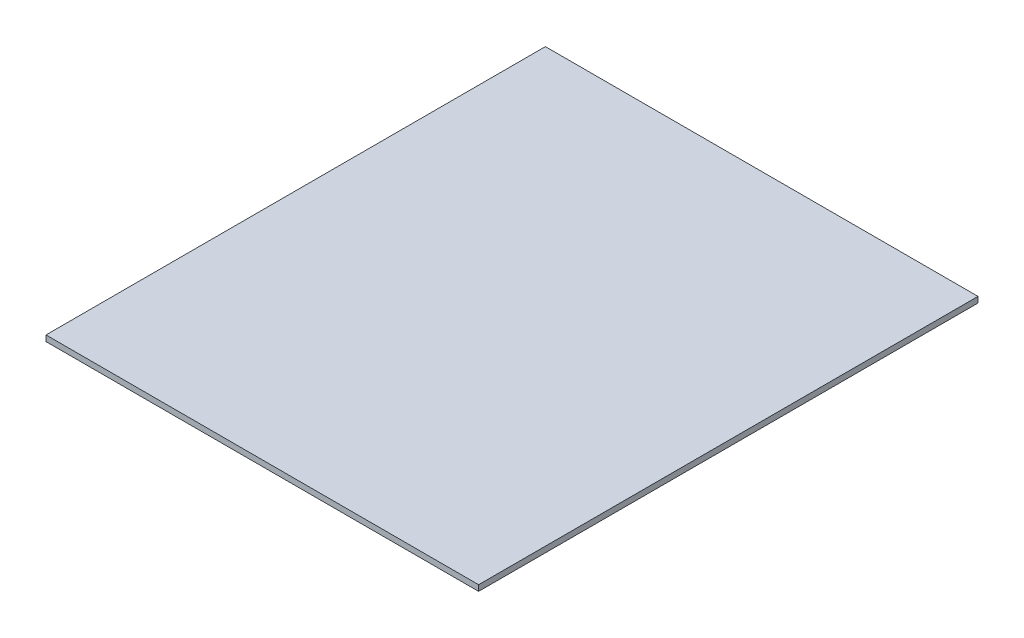
ISO-10303-21;
HEADER;
FILE_DESCRIPTION(('STEP AP214'),'2;1');
FILE_NAME('part.step','',(''),(''),'','','');
FILE_SCHEMA(('AUTOMOTIVE_DESIGN { 1 0 10303 214 1 1 1 1 }'));
ENDSEC;
DATA;
#1=APPLICATION_CONTEXT('core data for automotive mechanical design processes');
#2=APPLICATION_PROTOCOL_DEFINITION('international standard','automotive_design',2000,#1);
#3=PRODUCT_CONTEXT('',#1,'mechanical');
#4=PRODUCT('Part','Part','',(#3));
#5=PRODUCT_RELATED_PRODUCT_CATEGORY('part','',(#4));
#6=PRODUCT_DEFINITION_FORMATION('','',#4);
#7=PRODUCT_DEFINITION_CONTEXT('part definition',#1,'design');
#8=PRODUCT_DEFINITION('design','',#6,#7);
#9=PRODUCT_DEFINITION_SHAPE('','',#8);
#10=(LENGTH_UNIT() NAMED_UNIT(*) SI_UNIT(.MILLI.,.METRE.));
#11=(NAMED_UNIT(*) PLANE_ANGLE_UNIT() SI_UNIT($,.RADIAN.));
#12=(NAMED_UNIT(*) SI_UNIT($,.STERADIAN.) SOLID_ANGLE_UNIT());
#13=UNCERTAINTY_MEASURE_WITH_UNIT(LENGTH_MEASURE(1.E-05),#10,'distance_accuracy_value','');
#14=(GEOMETRIC_REPRESENTATION_CONTEXT(3) GLOBAL_UNCERTAINTY_ASSIGNED_CONTEXT((#13)) GLOBAL_UNIT_ASSIGNED_CONTEXT((#10,
#11,#12)) REPRESENTATION_CONTEXT('',''));
#15=CARTESIAN_POINT('',(0.,0.,0.));
#16=DIRECTION('',(0.,0.,1.));
#17=DIRECTION('',(1.,0.,0.));
#18=AXIS2_PLACEMENT_3D('',#15,#16,#17);
#19=CARTESIAN_POINT('',(-459.51000000745,17.999995738269,225.010000000001));
#20=CARTESIAN_POINT('',(-310.49000000745,17.999995738269,225.010000000001));
#21=CARTESIAN_POINT('',(-459.51000000745,17.999995738269,52.990000000001));
#22=CARTESIAN_POINT('',(-310.49000000745,17.999995738269,52.990000000001));
#23=(BOUNDED_SURFACE() B_SPLINE_SURFACE(1,1,((#19,#20),(#21,#22)),.UNSPECIFIED.,.F.,.F.,
.F.) B_SPLINE_SURFACE_WITH_KNOTS((2,2),(2,2),(-8.601,8.601),(-7.451,7.451),
.UNSPECIFIED.) GEOMETRIC_REPRESENTATION_ITEM() RATIONAL_B_SPLINE_SURFACE(((1.,1.),(1.,1.))) REPRESENTATION_ITEM('') SURFACE());
#24=CARTESIAN_POINT('',(-459.50000000745,17.999995738269,53.000000000001));
#25=CARTESIAN_POINT('',(-310.50000000745,17.999995738269,53.000000000001));
#26=(BOUNDED_CURVE() B_SPLINE_CURVE(1,(#24,#25),.UNSPECIFIED.,.F.,
.F.) B_SPLINE_CURVE_WITH_KNOTS((2,2),(-7.45,7.45),
.UNSPECIFIED.) CURVE() GEOMETRIC_REPRESENTATION_ITEM() RATIONAL_B_SPLINE_CURVE((1.,1.)) REPRESENTATION_ITEM(''));
#27=CARTESIAN_POINT('',(-459.50000000745,17.999995738269,53.000000000001));
#28=VERTEX_POINT('',#27);
#29=CARTESIAN_POINT('',(-310.50000000745,17.999995738269,53.000000000001));
#30=VERTEX_POINT('',#29);
#31=EDGE_CURVE('E11',#28,#30,#26,.T.);
#32=CARTESIAN_POINT('',(-310.50000000745,17.999995738269,53.000000000001));
#33=CARTESIAN_POINT('',(-310.50000000745,17.999995738269,225.000000000001));
#34=(BOUNDED_CURVE() B_SPLINE_CURVE(1,(#32,#33),.UNSPECIFIED.,.F.,
.F.) B_SPLINE_CURVE_WITH_KNOTS((2,2),(-8.6,8.6),
.UNSPECIFIED.) CURVE() GEOMETRIC_REPRESENTATION_ITEM() RATIONAL_B_SPLINE_CURVE((1.,1.)) REPRESENTATION_ITEM(''));
#35=CARTESIAN_POINT('',(-310.50000000745,17.999995738269,225.000000000001));
#36=VERTEX_POINT('',#35);
#37=EDGE_CURVE('E31',#30,#36,#34,.T.);
#38=CARTESIAN_POINT('',(-310.50000000745,17.999995738269,225.000000000001));
#39=CARTESIAN_POINT('',(-459.50000000745,17.999995738269,225.000000000001));
#40=(BOUNDED_CURVE() B_SPLINE_CURVE(1,(#38,#39),.UNSPECIFIED.,.F.,
.F.) B_SPLINE_CURVE_WITH_KNOTS((2,2),(-7.45,7.45),
.UNSPECIFIED.) CURVE() GEOMETRIC_REPRESENTATION_ITEM() RATIONAL_B_SPLINE_CURVE((1.,1.)) REPRESENTATION_ITEM(''));
#41=CARTESIAN_POINT('',(-459.50000000745,17.999995738269,225.000000000001));
#42=VERTEX_POINT('',#41);
#43=EDGE_CURVE('E116',#36,#42,#40,.T.);
#44=CARTESIAN_POINT('',(-459.50000000745,17.999995738269,225.000000000001));
#45=CARTESIAN_POINT('',(-459.50000000745,17.999995738269,53.000000000001));
#46=(BOUNDED_CURVE() B_SPLINE_CURVE(1,(#44,#45),.UNSPECIFIED.,.F.,
.F.) B_SPLINE_CURVE_WITH_KNOTS((2,2),(-8.6,8.6),
.UNSPECIFIED.) CURVE() GEOMETRIC_REPRESENTATION_ITEM() RATIONAL_B_SPLINE_CURVE((1.,1.)) REPRESENTATION_ITEM(''));
#47=EDGE_CURVE('E80',#42,#28,#46,.T.);
#48=ORIENTED_EDGE('',*,*,#31,.T.);
#49=ORIENTED_EDGE('',*,*,#37,.T.);
#50=ORIENTED_EDGE('',*,*,#43,.T.);
#51=ORIENTED_EDGE('',*,*,#47,.T.);
#52=EDGE_LOOP('',(#48,#49,#50,#51));
#53=FACE_BOUND('',#52,.T.);
#54=ADVANCED_FACE('F16',(#53),#23,.T.);
#55=CARTESIAN_POINT('',(-459.51000000745,19.999995738269,52.990000000001));
#56=CARTESIAN_POINT('',(-310.49000000745,19.999995738269,52.990000000001));
#57=CARTESIAN_POINT('',(-459.51000000745,19.999995738269,225.010000000001));
#58=CARTESIAN_POINT('',(-310.49000000745,19.999995738269,225.010000000001));
#59=(BOUNDED_SURFACE() B_SPLINE_SURFACE(1,1,((#55,#56),(#57,#58)),.UNSPECIFIED.,.F.,.F.,
.F.) B_SPLINE_SURFACE_WITH_KNOTS((2,2),(2,2),(-8.601,8.601),(-7.451,7.451),
.UNSPECIFIED.) GEOMETRIC_REPRESENTATION_ITEM() RATIONAL_B_SPLINE_SURFACE(((1.,1.),(1.,1.))) REPRESENTATION_ITEM('') SURFACE());
#60=CARTESIAN_POINT('',(-310.50000000745,19.999995738269,53.000000000001));
#61=CARTESIAN_POINT('',(-459.50000000745,19.999995738269,53.000000000001));
#62=(BOUNDED_CURVE() B_SPLINE_CURVE(1,(#60,#61),.UNSPECIFIED.,.F.,
.F.) B_SPLINE_CURVE_WITH_KNOTS((2,2),(-7.45,7.45),
.UNSPECIFIED.) CURVE() GEOMETRIC_REPRESENTATION_ITEM() RATIONAL_B_SPLINE_CURVE((1.,1.)) REPRESENTATION_ITEM(''));
#63=CARTESIAN_POINT('',(-310.50000000745,19.999995738269,53.000000000001));
#64=VERTEX_POINT('',#63);
#65=CARTESIAN_POINT('',(-459.50000000745,19.999995738269,53.000000000001));
#66=VERTEX_POINT('',#65);
#67=EDGE_CURVE('E74',#64,#66,#62,.T.);
#68=CARTESIAN_POINT('',(-459.50000000745,19.999995738269,53.000000000001));
#69=CARTESIAN_POINT('',(-459.50000000745,19.999995738269,225.000000000001));
#70=(BOUNDED_CURVE() B_SPLINE_CURVE(1,(#68,#69),.UNSPECIFIED.,.F.,
.F.) B_SPLINE_CURVE_WITH_KNOTS((2,2),(-8.6,8.6),
.UNSPECIFIED.) CURVE() GEOMETRIC_REPRESENTATION_ITEM() RATIONAL_B_SPLINE_CURVE((1.,1.)) REPRESENTATION_ITEM(''));
#71=CARTESIAN_POINT('',(-459.50000000745,19.999995738269,225.000000000001));
#72=VERTEX_POINT('',#71);
#73=EDGE_CURVE('E71',#66,#72,#70,.T.);
#74=CARTESIAN_POINT('',(-459.50000000745,19.999995738269,225.000000000001));
#75=CARTESIAN_POINT('',(-310.50000000745,19.999995738269,225.000000000001));
#76=(BOUNDED_CURVE() B_SPLINE_CURVE(1,(#74,#75),.UNSPECIFIED.,.F.,
.F.) B_SPLINE_CURVE_WITH_KNOTS((2,2),(-7.45,7.45),
.UNSPECIFIED.) CURVE() GEOMETRIC_REPRESENTATION_ITEM() RATIONAL_B_SPLINE_CURVE((1.,1.)) REPRESENTATION_ITEM(''));
#77=CARTESIAN_POINT('',(-310.50000000745,19.999995738269,225.000000000001));
#78=VERTEX_POINT('',#77);
#79=EDGE_CURVE('E65',#72,#78,#76,.T.);
#80=CARTESIAN_POINT('',(-310.50000000745,19.999995738269,225.000000000001));
#81=CARTESIAN_POINT('',(-310.50000000745,19.999995738269,53.000000000001));
#82=(BOUNDED_CURVE() B_SPLINE_CURVE(1,(#80,#81),.UNSPECIFIED.,.F.,
.F.) B_SPLINE_CURVE_WITH_KNOTS((2,2),(-8.6,8.6),
.UNSPECIFIED.) CURVE() GEOMETRIC_REPRESENTATION_ITEM() RATIONAL_B_SPLINE_CURVE((1.,1.)) REPRESENTATION_ITEM(''));
#83=EDGE_CURVE('E59',#78,#64,#82,.T.);
#84=ORIENTED_EDGE('',*,*,#67,.T.);
#85=ORIENTED_EDGE('',*,*,#73,.T.);
#86=ORIENTED_EDGE('',*,*,#79,.T.);
#87=ORIENTED_EDGE('',*,*,#83,.T.);
#88=EDGE_LOOP('',(#84,#85,#86,#87));
#89=FACE_BOUND('',#88,.T.);
#90=ADVANCED_FACE('F73',(#89),#59,.T.);
#91=CARTESIAN_POINT('',(-459.50000000745,17.989995738269,225.010000000001));
#92=CARTESIAN_POINT('',(-459.50000000745,17.989995738268,52.990000000001));
#93=CARTESIAN_POINT('',(-459.50000000745,20.009995738269,225.010000000001));
#94=CARTESIAN_POINT('',(-459.50000000745,20.009995738269,52.990000000001));
#95=(BOUNDED_SURFACE() B_SPLINE_SURFACE(1,1,((#91,#92),(#93,#94)),.UNSPECIFIED.,.F.,.F.,
.F.) B_SPLINE_SURFACE_WITH_KNOTS((2,2),(2,2),(-0.101,0.101000000000003),(-8.601,8.601),
.UNSPECIFIED.) GEOMETRIC_REPRESENTATION_ITEM() RATIONAL_B_SPLINE_SURFACE(((1.,1.),(1.,1.))) REPRESENTATION_ITEM('') SURFACE());
#96=CARTESIAN_POINT('',(-459.50000000745,17.999995738269,225.000000000001));
#97=CARTESIAN_POINT('',(-459.50000000745,19.999995738269,225.000000000001));
#98=(BOUNDED_CURVE() B_SPLINE_CURVE(1,(#96,#97),.UNSPECIFIED.,.F.,
.F.) B_SPLINE_CURVE_WITH_KNOTS((2,2),(-0.1,0.0999999999999979),
.UNSPECIFIED.) CURVE() GEOMETRIC_REPRESENTATION_ITEM() RATIONAL_B_SPLINE_CURVE((1.,1.)) REPRESENTATION_ITEM(''));
#99=EDGE_CURVE('E69',#42,#72,#98,.T.);
#100=CARTESIAN_POINT('',(-459.50000000745,17.999995738269,53.000000000001));
#101=CARTESIAN_POINT('',(-459.50000000745,19.999995738269,53.000000000001));
#102=(BOUNDED_CURVE() B_SPLINE_CURVE(1,(#100,#101),.UNSPECIFIED.,.F.,
.F.) B_SPLINE_CURVE_WITH_KNOTS((2,2),(-0.1,0.0999999999999979),
.UNSPECIFIED.) CURVE() GEOMETRIC_REPRESENTATION_ITEM() RATIONAL_B_SPLINE_CURVE((1.,1.)) REPRESENTATION_ITEM(''));
#103=EDGE_CURVE('E95',#28,#66,#102,.T.);
#104=ORIENTED_EDGE('',*,*,#99,.T.);
#105=ORIENTED_EDGE('',*,*,#73,.F.);
#106=ORIENTED_EDGE('',*,*,#103,.F.);
#107=ORIENTED_EDGE('',*,*,#47,.F.);
#108=EDGE_LOOP('',(#104,#105,#106,#107));
#109=FACE_BOUND('',#108,.T.);
#110=ADVANCED_FACE('F79',(#109),#95,.T.);
#111=CARTESIAN_POINT('',(-459.51000000745,20.009995738269,225.000000000001));
#112=CARTESIAN_POINT('',(-310.49000000745,20.009995738269,225.000000000001));
#113=CARTESIAN_POINT('',(-459.51000000745,17.989995738269,225.000000000001));
#114=CARTESIAN_POINT('',(-310.49000000745,17.989995738269,225.000000000001));
#115=(BOUNDED_SURFACE() B_SPLINE_SURFACE(1,1,((#111,#112),(#113,#114)),.UNSPECIFIED.,.F.,.F.,
.F.) B_SPLINE_SURFACE_WITH_KNOTS((2,2),(2,2),(-0.101000000000003,0.101000000000003),(-7.451,
7.451),.UNSPECIFIED.) GEOMETRIC_REPRESENTATION_ITEM() RATIONAL_B_SPLINE_SURFACE(((1.,1.),(1.,1.))) REPRESENTATION_ITEM('') SURFACE());
#116=CARTESIAN_POINT('',(-310.50000000745,17.999995738269,225.000000000001));
#117=CARTESIAN_POINT('',(-310.50000000745,19.999995738269,225.000000000001));
#118=(BOUNDED_CURVE() B_SPLINE_CURVE(1,(#116,#117),.UNSPECIFIED.,.F.,
.F.) B_SPLINE_CURVE_WITH_KNOTS((2,2),(-0.0999999999999979,0.1),
.UNSPECIFIED.) CURVE() GEOMETRIC_REPRESENTATION_ITEM() RATIONAL_B_SPLINE_CURVE((1.,1.)) REPRESENTATION_ITEM(''));
#119=EDGE_CURVE('E22',#36,#78,#118,.T.);
#120=ORIENTED_EDGE('',*,*,#119,.T.);
#121=ORIENTED_EDGE('',*,*,#79,.F.);
#122=ORIENTED_EDGE('',*,*,#99,.F.);
#123=ORIENTED_EDGE('',*,*,#43,.F.);
#124=EDGE_LOOP('',(#120,#121,#122,#123));
#125=FACE_BOUND('',#124,.T.);
#126=ADVANCED_FACE('F67',(#125),#115,.T.);
#127=CARTESIAN_POINT('',(-310.50000000745,20.009995738269,225.010000000001));
#128=CARTESIAN_POINT('',(-310.50000000745,20.009995738269,52.990000000001));
#129=CARTESIAN_POINT('',(-310.50000000745,17.989995738269,225.010000000001));
#130=CARTESIAN_POINT('',(-310.50000000745,17.989995738269,52.990000000001));
#131=(BOUNDED_SURFACE() B_SPLINE_SURFACE(1,1,((#127,#128),(#129,#130)),.UNSPECIFIED.,.F.,.F.,
.F.) B_SPLINE_SURFACE_WITH_KNOTS((2,2),(2,2),(-0.101,0.101000000000003),(-8.601,8.601),
.UNSPECIFIED.) GEOMETRIC_REPRESENTATION_ITEM() RATIONAL_B_SPLINE_SURFACE(((1.,1.),(1.,1.))) REPRESENTATION_ITEM('') SURFACE());
#132=CARTESIAN_POINT('',(-310.50000000745,17.999995738269,53.000000000001));
#133=CARTESIAN_POINT('',(-310.50000000745,19.999995738269,53.000000000001));
#134=(BOUNDED_CURVE() B_SPLINE_CURVE(1,(#132,#133),.UNSPECIFIED.,.F.,
.F.) B_SPLINE_CURVE_WITH_KNOTS((2,2),(-0.0999999999999979,0.1),
.UNSPECIFIED.) CURVE() GEOMETRIC_REPRESENTATION_ITEM() RATIONAL_B_SPLINE_CURVE((1.,1.)) REPRESENTATION_ITEM(''));
#135=EDGE_CURVE('E91',#30,#64,#134,.T.);
#136=ORIENTED_EDGE('',*,*,#135,.T.);
#137=ORIENTED_EDGE('',*,*,#83,.F.);
#138=ORIENTED_EDGE('',*,*,#119,.F.);
#139=ORIENTED_EDGE('',*,*,#37,.F.);
#140=EDGE_LOOP('',(#136,#137,#138,#139));
#141=FACE_BOUND('',#140,.T.);
#142=ADVANCED_FACE('F165',(#141),#131,.T.);
#143=CARTESIAN_POINT('',(-459.51000000745,17.989995738269,53.000000000001));
#144=CARTESIAN_POINT('',(-310.49000000745,17.989995738269,53.000000000001));
#145=CARTESIAN_POINT('',(-459.51000000745,20.009995738269,53.000000000001));
#146=CARTESIAN_POINT('',(-310.49000000745,20.009995738269,53.000000000001));
#147=(BOUNDED_SURFACE() B_SPLINE_SURFACE(1,1,((#143,#144),(#145,#146)),.UNSPECIFIED.,.F.,.F.,
.F.) B_SPLINE_SURFACE_WITH_KNOTS((2,2),(2,2),(-0.101000000000003,0.101000000000003),(-7.451,
7.451),.UNSPECIFIED.) GEOMETRIC_REPRESENTATION_ITEM() RATIONAL_B_SPLINE_SURFACE(((1.,1.),(1.,1.))) REPRESENTATION_ITEM('') SURFACE());
#148=ORIENTED_EDGE('',*,*,#103,.T.);
#149=ORIENTED_EDGE('',*,*,#67,.F.);
#150=ORIENTED_EDGE('',*,*,#135,.F.);
#151=ORIENTED_EDGE('',*,*,#31,.F.);
#152=EDGE_LOOP('',(#148,#149,#150,#151));
#153=FACE_BOUND('',#152,.T.);
#154=ADVANCED_FACE('F18',(#153),#147,.T.);
#155=CLOSED_SHELL('',(#54,#90,#110,#126,#142,#154));
#156=MANIFOLD_SOLID_BREP('B1',#155);
#157=ADVANCED_BREP_SHAPE_REPRESENTATION('',(#18,#156),#14);
#158=SHAPE_DEFINITION_REPRESENTATION(#9,#157);
ENDSEC;
END-ISO-10303-21;
